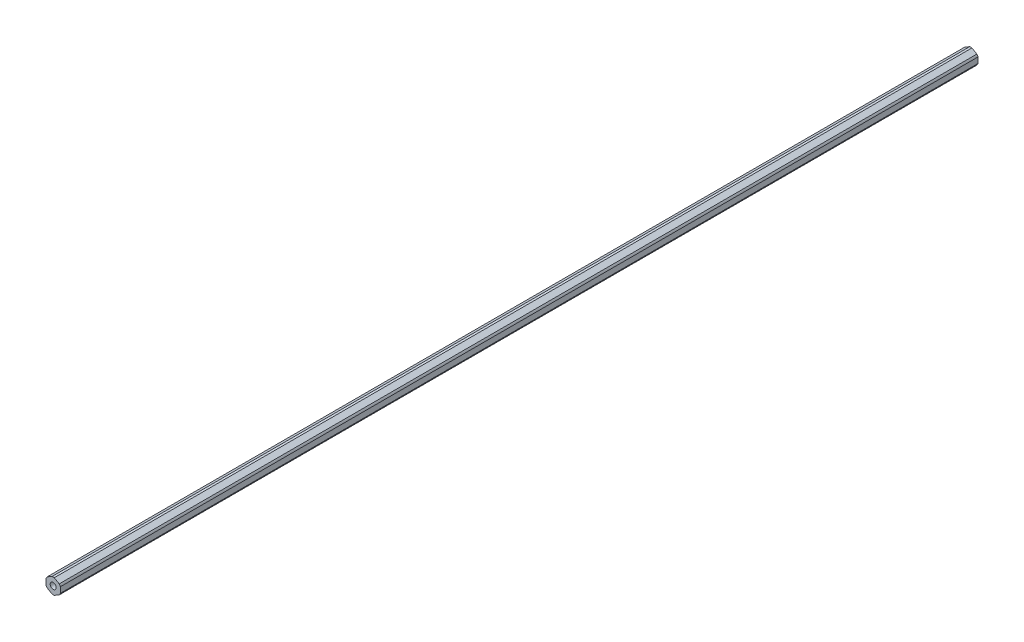
ISO-10303-21;
HEADER;
FILE_DESCRIPTION(('STEP AP214'),'2;1');
FILE_NAME('part.step','',(''),(''),'','','');
FILE_SCHEMA(('AUTOMOTIVE_DESIGN { 1 0 10303 214 1 1 1 1 }'));
ENDSEC;
DATA;
#1=APPLICATION_CONTEXT('core data for automotive mechanical design processes');
#2=APPLICATION_PROTOCOL_DEFINITION('international standard','automotive_design',2000,#1);
#3=PRODUCT_CONTEXT('',#1,'mechanical');
#4=PRODUCT('Part','Part','',(#3));
#5=PRODUCT_RELATED_PRODUCT_CATEGORY('part','',(#4));
#6=PRODUCT_DEFINITION_FORMATION('','',#4);
#7=PRODUCT_DEFINITION_CONTEXT('part definition',#1,'design');
#8=PRODUCT_DEFINITION('design','',#6,#7);
#9=PRODUCT_DEFINITION_SHAPE('','',#8);
#10=(LENGTH_UNIT() NAMED_UNIT(*) SI_UNIT(.MILLI.,.METRE.));
#11=(NAMED_UNIT(*) PLANE_ANGLE_UNIT() SI_UNIT($,.RADIAN.));
#12=(NAMED_UNIT(*) SI_UNIT($,.STERADIAN.) SOLID_ANGLE_UNIT());
#13=UNCERTAINTY_MEASURE_WITH_UNIT(LENGTH_MEASURE(1.E-05),#10,'distance_accuracy_value','');
#14=(GEOMETRIC_REPRESENTATION_CONTEXT(3) GLOBAL_UNCERTAINTY_ASSIGNED_CONTEXT((#13)) GLOBAL_UNIT_ASSIGNED_CONTEXT((#10,
#11,#12)) REPRESENTATION_CONTEXT('',''));
#15=CARTESIAN_POINT('',(0.,0.,0.));
#16=DIRECTION('',(0.,0.,1.));
#17=DIRECTION('',(1.,0.,0.));
#18=AXIS2_PLACEMENT_3D('',#15,#16,#17);
#19=CARTESIAN_POINT('',(4.7625,0.,304.8));
#20=DIRECTION('',(-1.,0.,0.));
#21=DIRECTION('',(0.,-1.,0.));
#22=AXIS2_PLACEMENT_3D('',#19,#20,#21);
#23=PLANE('',#22);
#24=DIRECTION('',(0.,1.,0.));
#25=VECTOR('',#24,1.);
#26=CARTESIAN_POINT('',(4.7625,0.,-304.8));
#27=LINE('',#26,#25);
#28=CARTESIAN_POINT('',(4.7625,-1.8932034040879,-304.8));
#29=VERTEX_POINT('',#28);
#30=CARTESIAN_POINT('',(4.7625,1.8932034040879,-304.8));
#31=VERTEX_POINT('',#30);
#32=EDGE_CURVE('E172',#29,#31,#27,.T.);
#33=ORIENTED_EDGE('',*,*,#32,.T.);
#34=DIRECTION('',(0.,0.,-1.));
#35=VECTOR('',#34,1.);
#36=CARTESIAN_POINT('',(4.7625,1.8932034040879,304.8));
#37=LINE('',#36,#35);
#38=CARTESIAN_POINT('',(4.7625,1.8932034040879,304.8));
#39=VERTEX_POINT('',#38);
#40=EDGE_CURVE('E11',#39,#31,#37,.T.);
#41=ORIENTED_EDGE('',*,*,#40,.F.);
#42=DIRECTION('',(0.,1.,0.));
#43=VECTOR('',#42,1.);
#44=CARTESIAN_POINT('',(4.7625,0.,304.8));
#45=LINE('',#44,#43);
#46=CARTESIAN_POINT('',(4.7625,-1.8932034040879,304.8));
#47=VERTEX_POINT('',#46);
#48=EDGE_CURVE('E231',#47,#39,#45,.T.);
#49=ORIENTED_EDGE('',*,*,#48,.F.);
#50=DIRECTION('',(0.,0.,-1.));
#51=VECTOR('',#50,1.);
#52=CARTESIAN_POINT('',(4.7625,-1.8932034040879,304.8));
#53=LINE('',#52,#51);
#54=EDGE_CURVE('E165',#47,#29,#53,.T.);
#55=ORIENTED_EDGE('',*,*,#54,.T.);
#56=EDGE_LOOP('',(#33,#41,#49,#55));
#57=FACE_BOUND('',#56,.T.);
#58=ADVANCED_FACE('F47',(#57),#23,.F.);
#59=CARTESIAN_POINT('',(0.,0.,304.8));
#60=DIRECTION('',(0.,0.,-1.));
#61=DIRECTION('',(-1.,0.,0.));
#62=AXIS2_PLACEMENT_3D('',#59,#60,#61);
#63=CYLINDRICAL_SURFACE('',#62,5.125000037);
#64=CARTESIAN_POINT('',(0.,0.,-304.8));
#65=DIRECTION('',(0.,0.,1.));
#66=DIRECTION('',(1.,0.,0.));
#67=AXIS2_PLACEMENT_3D('',#64,#65,#66);
#68=CIRCLE('',#67,5.125000037);
#69=CARTESIAN_POINT('',(4.02081224247129,3.17784428347944,-304.8));
#70=VERTEX_POINT('',#69);
#71=EDGE_CURVE('E175',#31,#70,#68,.T.);
#72=ORIENTED_EDGE('',*,*,#71,.T.);
#73=DIRECTION('',(0.,0.,-1.));
#74=VECTOR('',#73,1.);
#75=CARTESIAN_POINT('',(4.02081224247129,3.17784428347944,304.8));
#76=LINE('',#75,#74);
#77=CARTESIAN_POINT('',(4.02081224247129,3.17784428347944,304.8));
#78=VERTEX_POINT('',#77);
#79=EDGE_CURVE('E56',#78,#70,#76,.T.);
#80=ORIENTED_EDGE('',*,*,#79,.F.);
#81=CARTESIAN_POINT('',(0.,0.,304.8));
#82=DIRECTION('',(0.,0.,1.));
#83=DIRECTION('',(1.,0.,0.));
#84=AXIS2_PLACEMENT_3D('',#81,#82,#83);
#85=CIRCLE('',#84,5.125000037);
#86=EDGE_CURVE('E119',#39,#78,#85,.T.);
#87=ORIENTED_EDGE('',*,*,#86,.F.);
#88=ORIENTED_EDGE('',*,*,#40,.T.);
#89=EDGE_LOOP('',(#72,#80,#87,#88));
#90=FACE_BOUND('',#89,.T.);
#91=ADVANCED_FACE('F266',(#90),#63,.T.);
#92=CARTESIAN_POINT('',(2.38125,4.12444598552339,304.8));
#93=DIRECTION('',(-0.5,-0.866025403784439,0.));
#94=DIRECTION('',(0.866025403784439,-0.5,0.));
#95=AXIS2_PLACEMENT_3D('',#92,#93,#94);
#96=PLANE('',#95);
#97=DIRECTION('',(-0.866025403784439,0.5,0.));
#98=VECTOR('',#97,1.);
#99=CARTESIAN_POINT('',(2.38125,4.12444598552339,-304.8));
#100=LINE('',#99,#98);
#101=CARTESIAN_POINT('',(0.741687757528709,5.07104768756734,-304.8));
#102=VERTEX_POINT('',#101);
#103=EDGE_CURVE('E177',#70,#102,#100,.T.);
#104=ORIENTED_EDGE('',*,*,#103,.T.);
#105=DIRECTION('',(0.,0.,-1.));
#106=VECTOR('',#105,1.);
#107=CARTESIAN_POINT('',(0.741687757528709,5.07104768756734,304.8));
#108=LINE('',#107,#106);
#109=CARTESIAN_POINT('',(0.741687757528709,5.07104768756734,304.8));
#110=VERTEX_POINT('',#109);
#111=EDGE_CURVE('E207',#110,#102,#108,.T.);
#112=ORIENTED_EDGE('',*,*,#111,.F.);
#113=DIRECTION('',(-0.866025403784439,0.5,0.));
#114=VECTOR('',#113,1.);
#115=CARTESIAN_POINT('',(2.38125,4.12444598552339,304.8));
#116=LINE('',#115,#114);
#117=EDGE_CURVE('E215',#78,#110,#116,.T.);
#118=ORIENTED_EDGE('',*,*,#117,.F.);
#119=ORIENTED_EDGE('',*,*,#79,.T.);
#120=EDGE_LOOP('',(#104,#112,#118,#119));
#121=FACE_BOUND('',#120,.T.);
#122=ADVANCED_FACE('F213',(#121),#96,.F.);
#123=CARTESIAN_POINT('',(-0.741687757528708,5.07104768756734,-304.8));
#124=VERTEX_POINT('',#123);
#125=EDGE_CURVE('E178',#102,#124,#68,.T.);
#126=ORIENTED_EDGE('',*,*,#125,.T.);
#127=DIRECTION('',(0.,0.,-1.));
#128=VECTOR('',#127,1.);
#129=CARTESIAN_POINT('',(-0.741687757528708,5.07104768756734,304.8));
#130=LINE('',#129,#128);
#131=CARTESIAN_POINT('',(-0.741687757528708,5.07104768756734,304.8));
#132=VERTEX_POINT('',#131);
#133=EDGE_CURVE('E204',#132,#124,#130,.T.);
#134=ORIENTED_EDGE('',*,*,#133,.F.);
#135=EDGE_CURVE('E237',#110,#132,#85,.T.);
#136=ORIENTED_EDGE('',*,*,#135,.F.);
#137=ORIENTED_EDGE('',*,*,#111,.T.);
#138=EDGE_LOOP('',(#126,#134,#136,#137));
#139=FACE_BOUND('',#138,.T.);
#140=ADVANCED_FACE('F248',(#139),#63,.T.);
#141=CARTESIAN_POINT('',(-2.38125,4.12444598552339,304.8));
#142=DIRECTION('',(0.5,-0.866025403784439,0.));
#143=DIRECTION('',(0.866025403784439,0.5,0.));
#144=AXIS2_PLACEMENT_3D('',#141,#142,#143);
#145=PLANE('',#144);
#146=DIRECTION('',(-0.866025403784439,-0.5,0.));
#147=VECTOR('',#146,1.);
#148=CARTESIAN_POINT('',(-2.38125,4.12444598552339,-304.8));
#149=LINE('',#148,#147);
#150=CARTESIAN_POINT('',(-4.02081224247129,3.17784428347945,-304.8));
#151=VERTEX_POINT('',#150);
#152=EDGE_CURVE('E180',#124,#151,#149,.T.);
#153=ORIENTED_EDGE('',*,*,#152,.T.);
#154=DIRECTION('',(0.,0.,-1.));
#155=VECTOR('',#154,1.);
#156=CARTESIAN_POINT('',(-4.02081224247129,3.17784428347945,304.8));
#157=LINE('',#156,#155);
#158=CARTESIAN_POINT('',(-4.02081224247129,3.17784428347945,304.8));
#159=VERTEX_POINT('',#158);
#160=EDGE_CURVE('E201',#159,#151,#157,.T.);
#161=ORIENTED_EDGE('',*,*,#160,.F.);
#162=DIRECTION('',(-0.866025403784439,-0.5,0.));
#163=VECTOR('',#162,1.);
#164=CARTESIAN_POINT('',(-2.38125,4.12444598552339,304.8));
#165=LINE('',#164,#163);
#166=EDGE_CURVE('E239',#132,#159,#165,.T.);
#167=ORIENTED_EDGE('',*,*,#166,.F.);
#168=ORIENTED_EDGE('',*,*,#133,.T.);
#169=EDGE_LOOP('',(#153,#161,#167,#168));
#170=FACE_BOUND('',#169,.T.);
#171=ADVANCED_FACE('F250',(#170),#145,.F.);
#172=CARTESIAN_POINT('',(-4.7625,1.8932034040879,-304.8));
#173=VERTEX_POINT('',#172);
#174=EDGE_CURVE('E182',#151,#173,#68,.T.);
#175=ORIENTED_EDGE('',*,*,#174,.T.);
#176=DIRECTION('',(0.,0.,-1.));
#177=VECTOR('',#176,1.);
#178=CARTESIAN_POINT('',(-4.7625,1.8932034040879,304.8));
#179=LINE('',#178,#177);
#180=CARTESIAN_POINT('',(-4.7625,1.8932034040879,304.8));
#181=VERTEX_POINT('',#180);
#182=EDGE_CURVE('E198',#181,#173,#179,.T.);
#183=ORIENTED_EDGE('',*,*,#182,.F.);
#184=EDGE_CURVE('E240',#159,#181,#85,.T.);
#185=ORIENTED_EDGE('',*,*,#184,.F.);
#186=ORIENTED_EDGE('',*,*,#160,.T.);
#187=EDGE_LOOP('',(#175,#183,#185,#186));
#188=FACE_BOUND('',#187,.T.);
#189=ADVANCED_FACE('F251',(#188),#63,.T.);
#190=CARTESIAN_POINT('',(-4.7625,0.,304.8));
#191=DIRECTION('',(1.,0.,0.));
#192=DIRECTION('',(0.,0.,-1.));
#193=AXIS2_PLACEMENT_3D('',#190,#191,#192);
#194=PLANE('',#193);
#195=DIRECTION('',(0.,-1.,0.));
#196=VECTOR('',#195,1.);
#197=CARTESIAN_POINT('',(-4.7625,0.,-304.8));
#198=LINE('',#197,#196);
#199=CARTESIAN_POINT('',(-4.7625,-1.8932034040879,-304.8));
#200=VERTEX_POINT('',#199);
#201=EDGE_CURVE('E183',#173,#200,#198,.T.);
#202=ORIENTED_EDGE('',*,*,#201,.T.);
#203=DIRECTION('',(0.,0.,-1.));
#204=VECTOR('',#203,1.);
#205=CARTESIAN_POINT('',(-4.7625,-1.8932034040879,304.8));
#206=LINE('',#205,#204);
#207=CARTESIAN_POINT('',(-4.7625,-1.8932034040879,304.8));
#208=VERTEX_POINT('',#207);
#209=EDGE_CURVE('E195',#208,#200,#206,.T.);
#210=ORIENTED_EDGE('',*,*,#209,.F.);
#211=DIRECTION('',(0.,-1.,0.));
#212=VECTOR('',#211,1.);
#213=CARTESIAN_POINT('',(-4.7625,0.,304.8));
#214=LINE('',#213,#212);
#215=EDGE_CURVE('E241',#181,#208,#214,.T.);
#216=ORIENTED_EDGE('',*,*,#215,.F.);
#217=ORIENTED_EDGE('',*,*,#182,.T.);
#218=EDGE_LOOP('',(#202,#210,#216,#217));
#219=FACE_BOUND('',#218,.T.);
#220=ADVANCED_FACE('F254',(#219),#194,.F.);
#221=CARTESIAN_POINT('',(-4.02081224247129,-3.17784428347944,-304.8));
#222=VERTEX_POINT('',#221);
#223=EDGE_CURVE('E185',#200,#222,#68,.T.);
#224=ORIENTED_EDGE('',*,*,#223,.T.);
#225=DIRECTION('',(0.,0.,-1.));
#226=VECTOR('',#225,1.);
#227=CARTESIAN_POINT('',(-4.02081224247129,-3.17784428347944,304.8));
#228=LINE('',#227,#226);
#229=CARTESIAN_POINT('',(-4.02081224247129,-3.17784428347944,304.8));
#230=VERTEX_POINT('',#229);
#231=EDGE_CURVE('E192',#230,#222,#228,.T.);
#232=ORIENTED_EDGE('',*,*,#231,.F.);
#233=EDGE_CURVE('E155',#208,#230,#85,.T.);
#234=ORIENTED_EDGE('',*,*,#233,.F.);
#235=ORIENTED_EDGE('',*,*,#209,.T.);
#236=EDGE_LOOP('',(#224,#232,#234,#235));
#237=FACE_BOUND('',#236,.T.);
#238=ADVANCED_FACE('F256',(#237),#63,.T.);
#239=CARTESIAN_POINT('',(-2.38125,-4.12444598552339,304.8));
#240=DIRECTION('',(0.5,0.866025403784439,0.));
#241=DIRECTION('',(-0.866025403784438,0.5,0.));
#242=AXIS2_PLACEMENT_3D('',#239,#240,#241);
#243=PLANE('',#242);
#244=DIRECTION('',(0.866025403784439,-0.5,0.));
#245=VECTOR('',#244,1.);
#246=CARTESIAN_POINT('',(-2.38125,-4.12444598552339,-304.8));
#247=LINE('',#246,#245);
#248=CARTESIAN_POINT('',(-0.741687757528708,-5.07104768756734,-304.8));
#249=VERTEX_POINT('',#248);
#250=EDGE_CURVE('E186',#222,#249,#247,.T.);
#251=ORIENTED_EDGE('',*,*,#250,.T.);
#252=DIRECTION('',(0.,0.,-1.));
#253=VECTOR('',#252,1.);
#254=CARTESIAN_POINT('',(-0.741687757528708,-5.07104768756734,304.8));
#255=LINE('',#254,#253);
#256=CARTESIAN_POINT('',(-0.741687757528708,-5.07104768756734,304.8));
#257=VERTEX_POINT('',#256);
#258=EDGE_CURVE('E160',#257,#249,#255,.T.);
#259=ORIENTED_EDGE('',*,*,#258,.F.);
#260=DIRECTION('',(0.866025403784439,-0.5,0.));
#261=VECTOR('',#260,1.);
#262=CARTESIAN_POINT('',(-2.38125,-4.12444598552339,304.8));
#263=LINE('',#262,#261);
#264=EDGE_CURVE('E150',#230,#257,#263,.T.);
#265=ORIENTED_EDGE('',*,*,#264,.F.);
#266=ORIENTED_EDGE('',*,*,#231,.T.);
#267=EDGE_LOOP('',(#251,#259,#265,#266));
#268=FACE_BOUND('',#267,.T.);
#269=ADVANCED_FACE('F259',(#268),#243,.F.);
#270=CARTESIAN_POINT('',(0.741687757528704,-5.07104768756734,-304.8));
#271=VERTEX_POINT('',#270);
#272=EDGE_CURVE('E159',#249,#271,#68,.T.);
#273=ORIENTED_EDGE('',*,*,#272,.T.);
#274=DIRECTION('',(0.,0.,-1.));
#275=VECTOR('',#274,1.);
#276=CARTESIAN_POINT('',(0.741687757528704,-5.07104768756734,304.8));
#277=LINE('',#276,#275);
#278=CARTESIAN_POINT('',(0.741687757528704,-5.07104768756734,304.8));
#279=VERTEX_POINT('',#278);
#280=EDGE_CURVE('E156',#279,#271,#277,.T.);
#281=ORIENTED_EDGE('',*,*,#280,.F.);
#282=EDGE_CURVE('E144',#257,#279,#85,.T.);
#283=ORIENTED_EDGE('',*,*,#282,.F.);
#284=ORIENTED_EDGE('',*,*,#258,.T.);
#285=EDGE_LOOP('',(#273,#281,#283,#284));
#286=FACE_BOUND('',#285,.T.);
#287=ADVANCED_FACE('F157',(#286),#63,.T.);
#288=CARTESIAN_POINT('',(2.38125,-4.12444598552339,304.8));
#289=DIRECTION('',(-0.5,0.866025403784439,0.));
#290=DIRECTION('',(-0.866025403784439,-0.5,0.));
#291=AXIS2_PLACEMENT_3D('',#288,#289,#290);
#292=PLANE('',#291);
#293=DIRECTION('',(0.866025403784439,0.5,0.));
#294=VECTOR('',#293,1.);
#295=CARTESIAN_POINT('',(2.38125,-4.12444598552339,-304.8));
#296=LINE('',#295,#294);
#297=CARTESIAN_POINT('',(4.02081224247129,-3.17784428347944,-304.8));
#298=VERTEX_POINT('',#297);
#299=EDGE_CURVE('E105',#271,#298,#296,.T.);
#300=ORIENTED_EDGE('',*,*,#299,.T.);
#301=DIRECTION('',(0.,0.,-1.));
#302=VECTOR('',#301,1.);
#303=CARTESIAN_POINT('',(4.02081224247129,-3.17784428347944,304.8));
#304=LINE('',#303,#302);
#305=CARTESIAN_POINT('',(4.02081224247129,-3.17784428347944,304.8));
#306=VERTEX_POINT('',#305);
#307=EDGE_CURVE('E161',#306,#298,#304,.T.);
#308=ORIENTED_EDGE('',*,*,#307,.F.);
#309=DIRECTION('',(0.866025403784439,0.5,0.));
#310=VECTOR('',#309,1.);
#311=CARTESIAN_POINT('',(2.38125,-4.12444598552339,304.8));
#312=LINE('',#311,#310);
#313=EDGE_CURVE('E148',#279,#306,#312,.T.);
#314=ORIENTED_EDGE('',*,*,#313,.F.);
#315=ORIENTED_EDGE('',*,*,#280,.T.);
#316=EDGE_LOOP('',(#300,#308,#314,#315));
#317=FACE_BOUND('',#316,.T.);
#318=ADVANCED_FACE('F163',(#317),#292,.F.);
#319=CARTESIAN_POINT('',(0.,0.,304.8));
#320=DIRECTION('',(0.,0.,-1.));
#321=DIRECTION('',(-1.,0.,0.));
#322=AXIS2_PLACEMENT_3D('',#319,#320,#321);
#323=CYLINDRICAL_SURFACE('',#322,2.0193);
#324=CARTESIAN_POINT('',(0.,0.,304.8));
#325=DIRECTION('',(0.,0.,1.));
#326=DIRECTION('',(1.,0.,0.));
#327=AXIS2_PLACEMENT_3D('',#324,#325,#326);
#328=CIRCLE('',#327,2.0193);
#329=CARTESIAN_POINT('',(-2.0193,0.,304.8));
#330=VERTEX_POINT('',#329);
#331=EDGE_CURVE('E229',#330,#330,#328,.T.);
#332=CARTESIAN_POINT('',(0.,0.,-304.8));
#333=DIRECTION('',(0.,0.,1.));
#334=DIRECTION('',(1.,0.,0.));
#335=AXIS2_PLACEMENT_3D('',#332,#333,#334);
#336=CIRCLE('',#335,2.0193);
#337=CARTESIAN_POINT('',(-2.0193,0.,-304.8));
#338=VERTEX_POINT('',#337);
#339=EDGE_CURVE('E169',#338,#338,#336,.T.);
#340=CARTESIAN_POINT('',(-2.0193,0.,304.8));
#341=CARTESIAN_POINT('',(-2.0193,0.,298.45));
#342=CARTESIAN_POINT('',(-2.0193,0.,292.1));
#343=CARTESIAN_POINT('',(-2.0193,0.,279.4));
#344=CARTESIAN_POINT('',(-2.0193,0.,273.05));
#345=CARTESIAN_POINT('',(-2.0193,0.,260.35));
#346=CARTESIAN_POINT('',(-2.0193,0.,254.));
#347=CARTESIAN_POINT('',(-2.0193,0.,241.3));
#348=CARTESIAN_POINT('',(-2.0193,0.,234.95));
#349=CARTESIAN_POINT('',(-2.0193,0.,222.25));
#350=CARTESIAN_POINT('',(-2.0193,0.,215.9));
#351=CARTESIAN_POINT('',(-2.0193,0.,203.2));
#352=CARTESIAN_POINT('',(-2.0193,0.,196.85));
#353=CARTESIAN_POINT('',(-2.0193,0.,184.15));
#354=CARTESIAN_POINT('',(-2.0193,0.,177.8));
#355=CARTESIAN_POINT('',(-2.0193,0.,165.1));
#356=CARTESIAN_POINT('',(-2.0193,0.,158.75));
#357=CARTESIAN_POINT('',(-2.0193,0.,146.05));
#358=CARTESIAN_POINT('',(-2.0193,0.,139.7));
#359=CARTESIAN_POINT('',(-2.0193,0.,127.));
#360=CARTESIAN_POINT('',(-2.0193,0.,120.65));
#361=CARTESIAN_POINT('',(-2.0193,0.,107.95));
#362=CARTESIAN_POINT('',(-2.0193,0.,101.6));
#363=CARTESIAN_POINT('',(-2.0193,0.,88.9));
#364=CARTESIAN_POINT('',(-2.0193,0.,82.55));
#365=CARTESIAN_POINT('',(-2.0193,0.,69.85));
#366=CARTESIAN_POINT('',(-2.0193,0.,63.5));
#367=CARTESIAN_POINT('',(-2.0193,0.,50.8));
#368=CARTESIAN_POINT('',(-2.0193,0.,44.45));
#369=CARTESIAN_POINT('',(-2.0193,0.,31.75));
#370=CARTESIAN_POINT('',(-2.0193,0.,25.4));
#371=CARTESIAN_POINT('',(-2.0193,0.,12.7));
#372=CARTESIAN_POINT('',(-2.0193,0.,6.34999999999995));
#373=CARTESIAN_POINT('',(-2.0193,0.,-6.35000000000006));
#374=CARTESIAN_POINT('',(-2.0193,0.,-12.7000000000001));
#375=CARTESIAN_POINT('',(-2.0193,0.,-25.4000000000001));
#376=CARTESIAN_POINT('',(-2.0193,0.,-31.7500000000001));
#377=CARTESIAN_POINT('',(-2.0193,0.,-44.4500000000001));
#378=CARTESIAN_POINT('',(-2.0193,0.,-50.8000000000001));
#379=CARTESIAN_POINT('',(-2.0193,0.,-63.5000000000001));
#380=CARTESIAN_POINT('',(-2.0193,0.,-69.8500000000001));
#381=CARTESIAN_POINT('',(-2.0193,0.,-82.5500000000001));
#382=CARTESIAN_POINT('',(-2.0193,0.,-88.9000000000001));
#383=CARTESIAN_POINT('',(-2.0193,0.,-101.6));
#384=CARTESIAN_POINT('',(-2.0193,0.,-107.95));
#385=CARTESIAN_POINT('',(-2.0193,0.,-120.65));
#386=CARTESIAN_POINT('',(-2.0193,0.,-127.));
#387=CARTESIAN_POINT('',(-2.0193,0.,-139.7));
#388=CARTESIAN_POINT('',(-2.0193,0.,-146.05));
#389=CARTESIAN_POINT('',(-2.0193,0.,-158.75));
#390=CARTESIAN_POINT('',(-2.0193,0.,-165.1));
#391=CARTESIAN_POINT('',(-2.0193,0.,-177.8));
#392=CARTESIAN_POINT('',(-2.0193,0.,-184.15));
#393=CARTESIAN_POINT('',(-2.0193,0.,-196.85));
#394=CARTESIAN_POINT('',(-2.0193,0.,-203.2));
#395=CARTESIAN_POINT('',(-2.0193,0.,-215.9));
#396=CARTESIAN_POINT('',(-2.0193,0.,-222.25));
#397=CARTESIAN_POINT('',(-2.0193,0.,-234.95));
#398=CARTESIAN_POINT('',(-2.0193,0.,-241.3));
#399=CARTESIAN_POINT('',(-2.0193,0.,-254.));
#400=CARTESIAN_POINT('',(-2.0193,0.,-260.35));
#401=CARTESIAN_POINT('',(-2.0193,0.,-273.05));
#402=CARTESIAN_POINT('',(-2.0193,0.,-279.4));
#403=CARTESIAN_POINT('',(-2.0193,0.,-292.1));
#404=CARTESIAN_POINT('',(-2.0193,0.,-298.45));
#405=CARTESIAN_POINT('',(-2.0193,0.,-304.8));
#406=B_SPLINE_CURVE_WITH_KNOTS('',3,(#340,#341,#342,#343,#344,#345,#346,#347,#348,#349,#350,
#351,#352,#353,#354,#355,#356,#357,#358,#359,#360,#361,#362,#363,#364,#365,#366,#367,#368,#369,
#370,#371,#372,#373,#374,#375,#376,#377,#378,#379,#380,#381,#382,#383,#384,#385,#386,#387,#388,
#389,#390,#391,#392,#393,#394,#395,#396,#397,#398,#399,#400,#401,#402,#403,#404,#405),
.UNSPECIFIED.,.F.,.F.,(4,2,2,2,2,2,2,2,2,2,2,2,2,2,2,2,2,2,2,2,2,2,2,2,2,2,2,2,2,2,2,2,4),(0.,
19.05,38.1,57.15,76.2,95.25,114.3,133.35,152.4,171.45,190.5,209.55,228.6,247.65,266.7,285.75,
304.8,323.85,342.9,361.95,381.,400.05,419.1,438.15,457.2,476.25,495.3,514.35,533.4,552.45,571.5,
590.55,609.6),.UNSPECIFIED.);
#407=EDGE_CURVE('BSEAM49',#330,#338,#406,.T.);
#408=ORIENTED_EDGE('',*,*,#331,.T.);
#409=ORIENTED_EDGE('',*,*,#339,.F.);
#410=ORIENTED_EDGE('',*,*,#407,.T.);
#411=ORIENTED_EDGE('',*,*,#407,.F.);
#412=EDGE_LOOP('',(#408,#410,#409,#411));
#413=FACE_BOUND('',#412,.T.);
#414=ADVANCED_FACE('F49',(#413),#323,.F.);
#415=EDGE_CURVE('E111',#298,#29,#68,.T.);
#416=ORIENTED_EDGE('',*,*,#415,.T.);
#417=ORIENTED_EDGE('',*,*,#54,.F.);
#418=EDGE_CURVE('E64',#306,#47,#85,.T.);
#419=ORIENTED_EDGE('',*,*,#418,.F.);
#420=ORIENTED_EDGE('',*,*,#307,.T.);
#421=EDGE_LOOP('',(#416,#417,#419,#420));
#422=FACE_BOUND('',#421,.T.);
#423=ADVANCED_FACE('F263',(#422),#63,.T.);
#424=CARTESIAN_POINT('',(0.,0.,304.8));
#425=DIRECTION('',(0.,0.,1.));
#426=DIRECTION('',(1.,0.,0.));
#427=AXIS2_PLACEMENT_3D('',#424,#425,#426);
#428=PLANE('',#427);
#429=ORIENTED_EDGE('',*,*,#331,.F.);
#430=EDGE_LOOP('',(#429));
#431=FACE_BOUND('',#430,.T.);
#432=ORIENTED_EDGE('',*,*,#48,.T.);
#433=ORIENTED_EDGE('',*,*,#86,.T.);
#434=ORIENTED_EDGE('',*,*,#117,.T.);
#435=ORIENTED_EDGE('',*,*,#135,.T.);
#436=ORIENTED_EDGE('',*,*,#166,.T.);
#437=ORIENTED_EDGE('',*,*,#184,.T.);
#438=ORIENTED_EDGE('',*,*,#215,.T.);
#439=ORIENTED_EDGE('',*,*,#233,.T.);
#440=ORIENTED_EDGE('',*,*,#264,.T.);
#441=ORIENTED_EDGE('',*,*,#282,.T.);
#442=ORIENTED_EDGE('',*,*,#313,.T.);
#443=ORIENTED_EDGE('',*,*,#418,.T.);
#444=EDGE_LOOP('',(#432,#433,#434,#435,#436,#437,#438,#439,#440,#441,#442,#443));
#445=FACE_BOUND('',#444,.T.);
#446=ADVANCED_FACE('F146',(#431,#445),#428,.T.);
#447=CARTESIAN_POINT('',(0.,0.,-304.8));
#448=DIRECTION('',(0.,0.,1.));
#449=DIRECTION('',(1.,0.,0.));
#450=AXIS2_PLACEMENT_3D('',#447,#448,#449);
#451=PLANE('',#450);
#452=ORIENTED_EDGE('',*,*,#339,.T.);
#453=EDGE_LOOP('',(#452));
#454=FACE_BOUND('',#453,.T.);
#455=ORIENTED_EDGE('',*,*,#32,.F.);
#456=ORIENTED_EDGE('',*,*,#415,.F.);
#457=ORIENTED_EDGE('',*,*,#299,.F.);
#458=ORIENTED_EDGE('',*,*,#272,.F.);
#459=ORIENTED_EDGE('',*,*,#250,.F.);
#460=ORIENTED_EDGE('',*,*,#223,.F.);
#461=ORIENTED_EDGE('',*,*,#201,.F.);
#462=ORIENTED_EDGE('',*,*,#174,.F.);
#463=ORIENTED_EDGE('',*,*,#152,.F.);
#464=ORIENTED_EDGE('',*,*,#125,.F.);
#465=ORIENTED_EDGE('',*,*,#103,.F.);
#466=ORIENTED_EDGE('',*,*,#71,.F.);
#467=EDGE_LOOP('',(#455,#456,#457,#458,#459,#460,#461,#462,#463,#464,#465,#466));
#468=FACE_BOUND('',#467,.T.);
#469=ADVANCED_FACE('F219',(#454,#468),#451,.F.);
#470=CLOSED_SHELL('',(#58,#91,#122,#140,#171,#189,#220,#238,#269,#287,#318,#414,#423,#446,#469));
#471=MANIFOLD_SOLID_BREP('B2',#470);
#472=ADVANCED_BREP_SHAPE_REPRESENTATION('',(#18,#471),#14);
#473=SHAPE_DEFINITION_REPRESENTATION(#9,#472);
ENDSEC;
END-ISO-10303-21;
